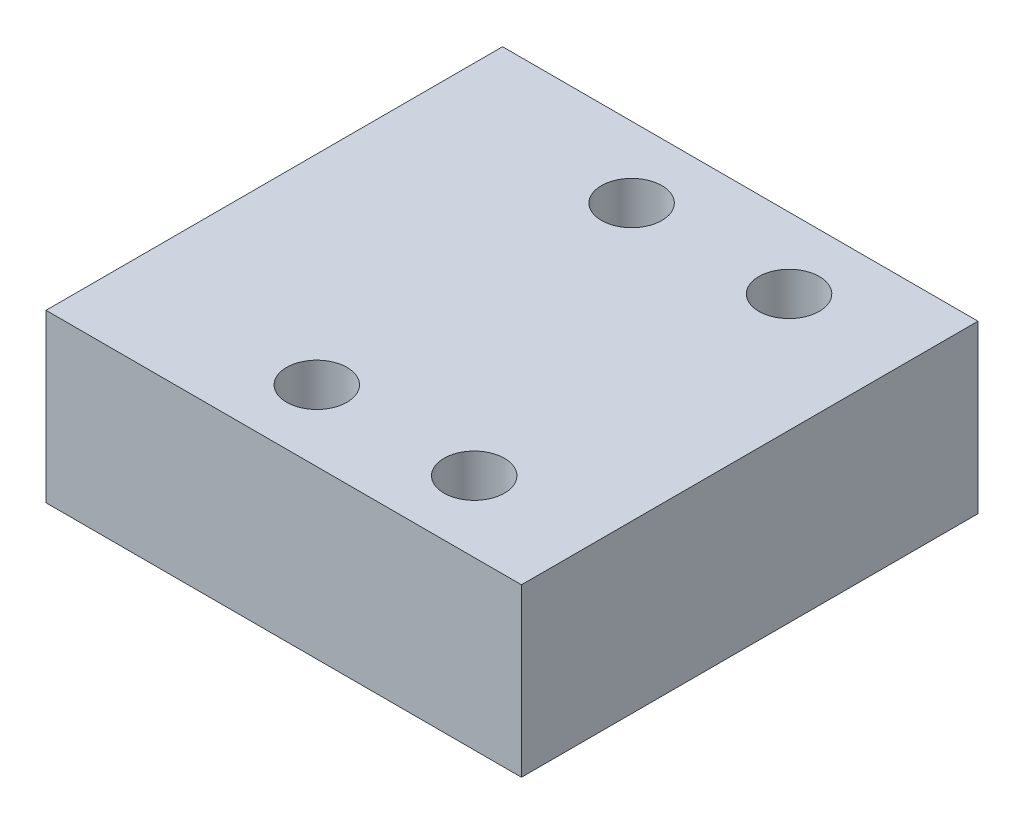
ISO-10303-21;
HEADER;
FILE_DESCRIPTION(('STEP AP214'),'2;1');
FILE_NAME('part.step','',(''),(''),'','','');
FILE_SCHEMA(('AUTOMOTIVE_DESIGN { 1 0 10303 214 1 1 1 1 }'));
ENDSEC;
DATA;
#1=APPLICATION_CONTEXT('core data for automotive mechanical design processes');
#2=APPLICATION_PROTOCOL_DEFINITION('international standard','automotive_design',2000,#1);
#3=PRODUCT_CONTEXT('',#1,'mechanical');
#4=PRODUCT('Part','Part','',(#3));
#5=PRODUCT_RELATED_PRODUCT_CATEGORY('part','',(#4));
#6=PRODUCT_DEFINITION_FORMATION('','',#4);
#7=PRODUCT_DEFINITION_CONTEXT('part definition',#1,'design');
#8=PRODUCT_DEFINITION('design','',#6,#7);
#9=PRODUCT_DEFINITION_SHAPE('','',#8);
#10=(LENGTH_UNIT() NAMED_UNIT(*) SI_UNIT(.MILLI.,.METRE.));
#11=(NAMED_UNIT(*) PLANE_ANGLE_UNIT() SI_UNIT($,.RADIAN.));
#12=(NAMED_UNIT(*) SI_UNIT($,.STERADIAN.) SOLID_ANGLE_UNIT());
#13=UNCERTAINTY_MEASURE_WITH_UNIT(LENGTH_MEASURE(1.E-05),#10,'distance_accuracy_value','');
#14=(GEOMETRIC_REPRESENTATION_CONTEXT(3) GLOBAL_UNCERTAINTY_ASSIGNED_CONTEXT((#13)) GLOBAL_UNIT_ASSIGNED_CONTEXT((#10,
#11,#12)) REPRESENTATION_CONTEXT('',''));
#15=CARTESIAN_POINT('',(0.,0.,0.));
#16=DIRECTION('',(0.,0.,1.));
#17=DIRECTION('',(1.,0.,0.));
#18=AXIS2_PLACEMENT_3D('',#15,#16,#17);
#19=CARTESIAN_POINT('',(0.,13.4493,0.));
#20=DIRECTION('',(0.,1.,0.));
#21=DIRECTION('',(0.,0.,1.));
#22=AXIS2_PLACEMENT_3D('',#19,#20,#21);
#23=PLANE('',#22);
#24=CARTESIAN_POINT('',(11.1229812145209,13.4493,15.3060546558223));
#25=DIRECTION('',(0.,1.,0.));
#26=DIRECTION('',(0.,0.,1.));
#27=AXIS2_PLACEMENT_3D('',#24,#25,#26);
#28=CIRCLE('',#27,2.4384);
#29=CARTESIAN_POINT('',(11.1229812145209,13.4493,17.7444546558223));
#30=VERTEX_POINT('',#29);
#31=EDGE_CURVE('E121',#30,#30,#28,.T.);
#32=ORIENTED_EDGE('',*,*,#31,.F.);
#33=EDGE_LOOP('',(#32));
#34=FACE_BOUND('',#33,.T.);
#35=CARTESIAN_POINT('',(-1.57701878547906,13.4493,-10.0939453441777));
#36=DIRECTION('',(0.,1.,0.));
#37=DIRECTION('',(0.,0.,1.));
#38=AXIS2_PLACEMENT_3D('',#35,#36,#37);
#39=CIRCLE('',#38,2.4384);
#40=CARTESIAN_POINT('',(-1.57701878547906,13.4493,-7.65554534417774));
#41=VERTEX_POINT('',#40);
#42=EDGE_CURVE('E100',#41,#41,#39,.T.);
#43=ORIENTED_EDGE('',*,*,#42,.F.);
#44=EDGE_LOOP('',(#43));
#45=FACE_BOUND('',#44,.T.);
#46=DIRECTION('',(0.,0.,1.));
#47=VECTOR('',#46,1.);
#48=CARTESIAN_POINT('',(-17.7060187854791,13.4493,-15.8089453441777));
#49=LINE('',#48,#47);
#50=CARTESIAN_POINT('',(-17.7060187854791,13.4493,-15.8089453441777));
#51=VERTEX_POINT('',#50);
#52=CARTESIAN_POINT('',(-17.7060187854791,13.4493,21.0210546558223));
#53=VERTEX_POINT('',#52);
#54=EDGE_CURVE('E85',#51,#53,#49,.T.);
#55=ORIENTED_EDGE('',*,*,#54,.T.);
#56=DIRECTION('',(1.,0.,0.));
#57=VECTOR('',#56,1.);
#58=CARTESIAN_POINT('',(-17.7060187854791,13.4493,21.0210546558223));
#59=LINE('',#58,#57);
#60=CARTESIAN_POINT('',(20.6479812145209,13.4493,21.0210546558223));
#61=VERTEX_POINT('',#60);
#62=EDGE_CURVE('E80',#53,#61,#59,.T.);
#63=ORIENTED_EDGE('',*,*,#62,.T.);
#64=DIRECTION('',(0.,0.,-1.));
#65=VECTOR('',#64,1.);
#66=CARTESIAN_POINT('',(20.6479812145209,13.4493,-15.8089453441777));
#67=LINE('',#66,#65);
#68=CARTESIAN_POINT('',(20.6479812145209,13.4493,-15.8089453441777));
#69=VERTEX_POINT('',#68);
#70=EDGE_CURVE('E83',#61,#69,#67,.T.);
#71=ORIENTED_EDGE('',*,*,#70,.T.);
#72=DIRECTION('',(-1.,0.,0.));
#73=VECTOR('',#72,1.);
#74=CARTESIAN_POINT('',(-17.7060187854791,13.4493,-15.8089453441777));
#75=LINE('',#74,#73);
#76=EDGE_CURVE('E50',#69,#51,#75,.T.);
#77=ORIENTED_EDGE('',*,*,#76,.T.);
#78=EDGE_LOOP('',(#55,#63,#71,#77));
#79=FACE_BOUND('',#78,.T.);
#80=CARTESIAN_POINT('',(11.1229812145209,13.4493,-10.0939453441777));
#81=DIRECTION('',(0.,1.,0.));
#82=DIRECTION('',(0.,0.,-1.));
#83=AXIS2_PLACEMENT_3D('',#80,#81,#82);
#84=CIRCLE('',#83,2.4384);
#85=CARTESIAN_POINT('',(11.1229812145209,13.4493,-12.5323453441777));
#86=VERTEX_POINT('',#85);
#87=EDGE_CURVE('E115',#86,#86,#84,.T.);
#88=ORIENTED_EDGE('',*,*,#87,.F.);
#89=EDGE_LOOP('',(#88));
#90=FACE_BOUND('',#89,.T.);
#91=CARTESIAN_POINT('',(-1.57701878547905,13.4493,15.3060546558223));
#92=DIRECTION('',(0.,1.,0.));
#93=DIRECTION('',(0.,0.,-1.));
#94=AXIS2_PLACEMENT_3D('',#91,#92,#93);
#95=CIRCLE('',#94,2.4384);
#96=CARTESIAN_POINT('',(-1.57701878547905,13.4493,12.8676546558223));
#97=VERTEX_POINT('',#96);
#98=EDGE_CURVE('E127',#97,#97,#95,.T.);
#99=ORIENTED_EDGE('',*,*,#98,.F.);
#100=EDGE_LOOP('',(#99));
#101=FACE_BOUND('',#100,.T.);
#102=ADVANCED_FACE('F33',(#34,#45,#79,#90,#101),#23,.T.);
#103=CARTESIAN_POINT('',(0.,0.,0.));
#104=DIRECTION('',(0.,1.,0.));
#105=DIRECTION('',(0.,0.,1.));
#106=AXIS2_PLACEMENT_3D('',#103,#104,#105);
#107=PLANE('',#106);
#108=CARTESIAN_POINT('',(11.1229812145209,0.,15.3060546558223));
#109=DIRECTION('',(0.,1.,0.));
#110=DIRECTION('',(0.,0.,1.));
#111=AXIS2_PLACEMENT_3D('',#108,#109,#110);
#112=CIRCLE('',#111,2.4384);
#113=CARTESIAN_POINT('',(11.1229812145209,0.,17.7444546558223));
#114=VERTEX_POINT('',#113);
#115=EDGE_CURVE('E124',#114,#114,#112,.T.);
#116=ORIENTED_EDGE('',*,*,#115,.T.);
#117=EDGE_LOOP('',(#116));
#118=FACE_BOUND('',#117,.T.);
#119=CARTESIAN_POINT('',(-1.57701878547906,0.,-10.0939453441777));
#120=DIRECTION('',(0.,1.,0.));
#121=DIRECTION('',(0.,0.,1.));
#122=AXIS2_PLACEMENT_3D('',#119,#120,#121);
#123=CIRCLE('',#122,2.4384);
#124=CARTESIAN_POINT('',(-1.57701878547906,0.,-7.65554534417774));
#125=VERTEX_POINT('',#124);
#126=EDGE_CURVE('E112',#125,#125,#123,.T.);
#127=ORIENTED_EDGE('',*,*,#126,.T.);
#128=EDGE_LOOP('',(#127));
#129=FACE_BOUND('',#128,.T.);
#130=DIRECTION('',(0.,0.,1.));
#131=VECTOR('',#130,1.);
#132=CARTESIAN_POINT('',(-17.7060187854791,0.,-15.8089453441777));
#133=LINE('',#132,#131);
#134=CARTESIAN_POINT('',(-17.7060187854791,0.,-15.8089453441777));
#135=VERTEX_POINT('',#134);
#136=CARTESIAN_POINT('',(-17.7060187854791,0.,21.0210546558223));
#137=VERTEX_POINT('',#136);
#138=EDGE_CURVE('E97',#135,#137,#133,.T.);
#139=ORIENTED_EDGE('',*,*,#138,.F.);
#140=DIRECTION('',(-1.,0.,0.));
#141=VECTOR('',#140,1.);
#142=CARTESIAN_POINT('',(-17.7060187854791,0.,-15.8089453441777));
#143=LINE('',#142,#141);
#144=CARTESIAN_POINT('',(20.6479812145209,0.,-15.8089453441777));
#145=VERTEX_POINT('',#144);
#146=EDGE_CURVE('E73',#145,#135,#143,.T.);
#147=ORIENTED_EDGE('',*,*,#146,.F.);
#148=DIRECTION('',(0.,0.,-1.));
#149=VECTOR('',#148,1.);
#150=CARTESIAN_POINT('',(20.6479812145209,0.,-15.8089453441777));
#151=LINE('',#150,#149);
#152=CARTESIAN_POINT('',(20.6479812145209,0.,21.0210546558223));
#153=VERTEX_POINT('',#152);
#154=EDGE_CURVE('E67',#153,#145,#151,.T.);
#155=ORIENTED_EDGE('',*,*,#154,.F.);
#156=DIRECTION('',(1.,0.,0.));
#157=VECTOR('',#156,1.);
#158=CARTESIAN_POINT('',(-17.7060187854791,0.,21.0210546558223));
#159=LINE('',#158,#157);
#160=EDGE_CURVE('E89',#137,#153,#159,.T.);
#161=ORIENTED_EDGE('',*,*,#160,.F.);
#162=EDGE_LOOP('',(#139,#147,#155,#161));
#163=FACE_BOUND('',#162,.T.);
#164=CARTESIAN_POINT('',(11.1229812145209,0.,-10.0939453441777));
#165=DIRECTION('',(0.,1.,0.));
#166=DIRECTION('',(0.,0.,-1.));
#167=AXIS2_PLACEMENT_3D('',#164,#165,#166);
#168=CIRCLE('',#167,2.4384);
#169=CARTESIAN_POINT('',(11.1229812145209,0.,-12.5323453441777));
#170=VERTEX_POINT('',#169);
#171=EDGE_CURVE('E118',#170,#170,#168,.T.);
#172=ORIENTED_EDGE('',*,*,#171,.T.);
#173=EDGE_LOOP('',(#172));
#174=FACE_BOUND('',#173,.T.);
#175=CARTESIAN_POINT('',(-1.57701878547905,0.,15.3060546558223));
#176=DIRECTION('',(0.,1.,0.));
#177=DIRECTION('',(0.,0.,-1.));
#178=AXIS2_PLACEMENT_3D('',#175,#176,#177);
#179=CIRCLE('',#178,2.4384);
#180=CARTESIAN_POINT('',(-1.57701878547905,0.,12.8676546558223));
#181=VERTEX_POINT('',#180);
#182=EDGE_CURVE('E130',#181,#181,#179,.T.);
#183=ORIENTED_EDGE('',*,*,#182,.T.);
#184=EDGE_LOOP('',(#183));
#185=FACE_BOUND('',#184,.T.);
#186=ADVANCED_FACE('F108',(#118,#129,#163,#174,#185),#107,.F.);
#187=CARTESIAN_POINT('',(-17.7060187854791,13.4493,-15.8089453441777));
#188=DIRECTION('',(1.,0.,0.));
#189=DIRECTION('',(0.,0.,-1.));
#190=AXIS2_PLACEMENT_3D('',#187,#188,#189);
#191=PLANE('',#190);
#192=ORIENTED_EDGE('',*,*,#138,.T.);
#193=DIRECTION('',(0.,-1.,0.));
#194=VECTOR('',#193,1.);
#195=CARTESIAN_POINT('',(-17.7060187854791,13.4493,21.0210546558223));
#196=LINE('',#195,#194);
#197=EDGE_CURVE('E11',#53,#137,#196,.T.);
#198=ORIENTED_EDGE('',*,*,#197,.F.);
#199=ORIENTED_EDGE('',*,*,#54,.F.);
#200=DIRECTION('',(0.,-1.,0.));
#201=VECTOR('',#200,1.);
#202=CARTESIAN_POINT('',(-17.7060187854791,13.4493,-15.8089453441777));
#203=LINE('',#202,#201);
#204=EDGE_CURVE('E93',#51,#135,#203,.T.);
#205=ORIENTED_EDGE('',*,*,#204,.T.);
#206=EDGE_LOOP('',(#192,#198,#199,#205));
#207=FACE_BOUND('',#206,.T.);
#208=ADVANCED_FACE('F35',(#207),#191,.F.);
#209=CARTESIAN_POINT('',(-17.7060187854791,13.4493,21.0210546558223));
#210=DIRECTION('',(0.,0.,-1.));
#211=DIRECTION('',(-1.,0.,0.));
#212=AXIS2_PLACEMENT_3D('',#209,#210,#211);
#213=PLANE('',#212);
#214=ORIENTED_EDGE('',*,*,#160,.T.);
#215=DIRECTION('',(0.,-1.,0.));
#216=VECTOR('',#215,1.);
#217=CARTESIAN_POINT('',(20.6479812145209,13.4493,21.0210546558223));
#218=LINE('',#217,#216);
#219=EDGE_CURVE('E42',#61,#153,#218,.T.);
#220=ORIENTED_EDGE('',*,*,#219,.F.);
#221=ORIENTED_EDGE('',*,*,#62,.F.);
#222=ORIENTED_EDGE('',*,*,#197,.T.);
#223=EDGE_LOOP('',(#214,#220,#221,#222));
#224=FACE_BOUND('',#223,.T.);
#225=ADVANCED_FACE('F88',(#224),#213,.F.);
#226=CARTESIAN_POINT('',(20.6479812145209,13.4493,-15.8089453441777));
#227=DIRECTION('',(-1.,0.,0.));
#228=DIRECTION('',(0.,0.,1.));
#229=AXIS2_PLACEMENT_3D('',#226,#227,#228);
#230=PLANE('',#229);
#231=ORIENTED_EDGE('',*,*,#154,.T.);
#232=DIRECTION('',(0.,-1.,0.));
#233=VECTOR('',#232,1.);
#234=CARTESIAN_POINT('',(20.6479812145209,13.4493,-15.8089453441777));
#235=LINE('',#234,#233);
#236=EDGE_CURVE('E90',#69,#145,#235,.T.);
#237=ORIENTED_EDGE('',*,*,#236,.F.);
#238=ORIENTED_EDGE('',*,*,#70,.F.);
#239=ORIENTED_EDGE('',*,*,#219,.T.);
#240=EDGE_LOOP('',(#231,#237,#238,#239));
#241=FACE_BOUND('',#240,.T.);
#242=ADVANCED_FACE('F91',(#241),#230,.F.);
#243=CARTESIAN_POINT('',(-17.7060187854791,13.4493,-15.8089453441777));
#244=DIRECTION('',(0.,0.,1.));
#245=DIRECTION('',(1.,0.,0.));
#246=AXIS2_PLACEMENT_3D('',#243,#244,#245);
#247=PLANE('',#246);
#248=ORIENTED_EDGE('',*,*,#146,.T.);
#249=ORIENTED_EDGE('',*,*,#204,.F.);
#250=ORIENTED_EDGE('',*,*,#76,.F.);
#251=ORIENTED_EDGE('',*,*,#236,.T.);
#252=EDGE_LOOP('',(#248,#249,#250,#251));
#253=FACE_BOUND('',#252,.T.);
#254=ADVANCED_FACE('F105',(#253),#247,.F.);
#255=CARTESIAN_POINT('',(-1.57701878547906,13.4493,-10.0939453441777));
#256=DIRECTION('',(0.,-1.,0.));
#257=DIRECTION('',(0.,0.,-1.));
#258=AXIS2_PLACEMENT_3D('',#255,#256,#257);
#259=CYLINDRICAL_SURFACE('',#258,2.4384);
#260=ORIENTED_EDGE('',*,*,#42,.T.);
#261=EDGE_LOOP('',(#260));
#262=FACE_BOUND('',#261,.T.);
#263=ORIENTED_EDGE('',*,*,#126,.F.);
#264=EDGE_LOOP('',(#263));
#265=FACE_BOUND('',#264,.T.);
#266=ADVANCED_FACE('F150',(#262,#265),#259,.F.);
#267=CARTESIAN_POINT('',(11.1229812145209,13.4493,-10.0939453441777));
#268=DIRECTION('',(0.,-1.,0.));
#269=DIRECTION('',(0.,0.,-1.));
#270=AXIS2_PLACEMENT_3D('',#267,#268,#269);
#271=CYLINDRICAL_SURFACE('',#270,2.4384);
#272=ORIENTED_EDGE('',*,*,#87,.T.);
#273=EDGE_LOOP('',(#272));
#274=FACE_BOUND('',#273,.T.);
#275=ORIENTED_EDGE('',*,*,#171,.F.);
#276=EDGE_LOOP('',(#275));
#277=FACE_BOUND('',#276,.T.);
#278=ADVANCED_FACE('F196',(#274,#277),#271,.F.);
#279=CARTESIAN_POINT('',(11.1229812145209,13.4493,15.3060546558223));
#280=DIRECTION('',(0.,-1.,0.));
#281=DIRECTION('',(0.,0.,-1.));
#282=AXIS2_PLACEMENT_3D('',#279,#280,#281);
#283=CYLINDRICAL_SURFACE('',#282,2.4384);
#284=ORIENTED_EDGE('',*,*,#31,.T.);
#285=EDGE_LOOP('',(#284));
#286=FACE_BOUND('',#285,.T.);
#287=ORIENTED_EDGE('',*,*,#115,.F.);
#288=EDGE_LOOP('',(#287));
#289=FACE_BOUND('',#288,.T.);
#290=ADVANCED_FACE('F204',(#286,#289),#283,.F.);
#291=CARTESIAN_POINT('',(-1.57701878547905,13.4493,15.3060546558223));
#292=DIRECTION('',(0.,-1.,0.));
#293=DIRECTION('',(0.,0.,-1.));
#294=AXIS2_PLACEMENT_3D('',#291,#292,#293);
#295=CYLINDRICAL_SURFACE('',#294,2.4384);
#296=ORIENTED_EDGE('',*,*,#98,.T.);
#297=EDGE_LOOP('',(#296));
#298=FACE_BOUND('',#297,.T.);
#299=ORIENTED_EDGE('',*,*,#182,.F.);
#300=EDGE_LOOP('',(#299));
#301=FACE_BOUND('',#300,.T.);
#302=ADVANCED_FACE('F136',(#298,#301),#295,.F.);
#303=CLOSED_SHELL('',(#102,#186,#208,#225,#242,#254,#266,#278,#290,#302));
#304=MANIFOLD_SOLID_BREP('B2',#303);
#305=ADVANCED_BREP_SHAPE_REPRESENTATION('',(#18,#304),#14);
#306=SHAPE_DEFINITION_REPRESENTATION(#9,#305);
ENDSEC;
END-ISO-10303-21;
